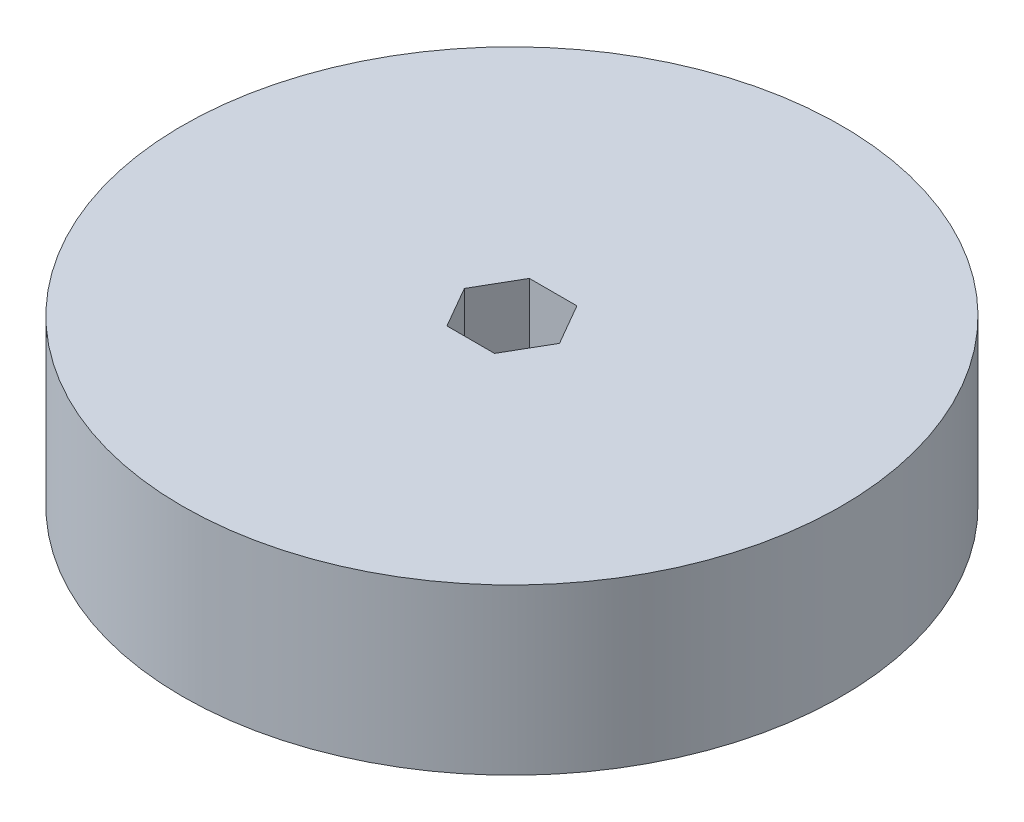
ISO-10303-21;
HEADER;
FILE_DESCRIPTION(('STEP AP214'),'2;1');
FILE_NAME('part.step','',(''),(''),'','','');
FILE_SCHEMA(('AUTOMOTIVE_DESIGN { 1 0 10303 214 1 1 1 1 }'));
ENDSEC;
DATA;
#1=APPLICATION_CONTEXT('core data for automotive mechanical design processes');
#2=APPLICATION_PROTOCOL_DEFINITION('international standard','automotive_design',2000,#1);
#3=PRODUCT_CONTEXT('',#1,'mechanical');
#4=PRODUCT('Part','Part','',(#3));
#5=PRODUCT_RELATED_PRODUCT_CATEGORY('part','',(#4));
#6=PRODUCT_DEFINITION_FORMATION('','',#4);
#7=PRODUCT_DEFINITION_CONTEXT('part definition',#1,'design');
#8=PRODUCT_DEFINITION('design','',#6,#7);
#9=PRODUCT_DEFINITION_SHAPE('','',#8);
#10=(LENGTH_UNIT() NAMED_UNIT(*) SI_UNIT(.MILLI.,.METRE.));
#11=(NAMED_UNIT(*) PLANE_ANGLE_UNIT() SI_UNIT($,.RADIAN.));
#12=(NAMED_UNIT(*) SI_UNIT($,.STERADIAN.) SOLID_ANGLE_UNIT());
#13=UNCERTAINTY_MEASURE_WITH_UNIT(LENGTH_MEASURE(1.E-05),#10,'distance_accuracy_value','');
#14=(GEOMETRIC_REPRESENTATION_CONTEXT(3) GLOBAL_UNCERTAINTY_ASSIGNED_CONTEXT((#13)) GLOBAL_UNIT_ASSIGNED_CONTEXT((#10,
#11,#12)) REPRESENTATION_CONTEXT('',''));
#15=CARTESIAN_POINT('',(0.,0.,0.));
#16=DIRECTION('',(0.,0.,1.));
#17=DIRECTION('',(1.,0.,0.));
#18=AXIS2_PLACEMENT_3D('',#15,#16,#17);
#19=CARTESIAN_POINT('',(0.,25.4,0.));
#20=DIRECTION('',(0.,1.,0.));
#21=DIRECTION('',(0.,0.,1.));
#22=AXIS2_PLACEMENT_3D('',#19,#20,#21);
#23=PLANE('',#22);
#24=CARTESIAN_POINT('',(0.,25.4,0.));
#25=DIRECTION('',(0.,1.,0.));
#26=DIRECTION('',(0.,0.,1.));
#27=AXIS2_PLACEMENT_3D('',#24,#25,#26);
#28=CIRCLE('',#27,50.8);
#29=CARTESIAN_POINT('',(0.,25.4,50.8));
#30=VERTEX_POINT('',#29);
#31=EDGE_CURVE('E11',#30,#30,#28,.T.);
#32=ORIENTED_EDGE('',*,*,#31,.T.);
#33=EDGE_LOOP('',(#32));
#34=FACE_BOUND('',#33,.T.);
#35=DIRECTION('',(0.5,0.,-0.866025403784439));
#36=VECTOR('',#35,1.);
#37=CARTESIAN_POINT('',(3.66617420935412,25.4,6.35));
#38=LINE('',#37,#36);
#39=CARTESIAN_POINT('',(3.66617420935412,25.4,6.35));
#40=VERTEX_POINT('',#39);
#41=CARTESIAN_POINT('',(7.33234841870824,25.4,0.));
#42=VERTEX_POINT('',#41);
#43=EDGE_CURVE('E106',#40,#42,#38,.T.);
#44=ORIENTED_EDGE('',*,*,#43,.F.);
#45=DIRECTION('',(1.,0.,0.));
#46=VECTOR('',#45,1.);
#47=CARTESIAN_POINT('',(-3.66617420935412,25.4,6.35));
#48=LINE('',#47,#46);
#49=CARTESIAN_POINT('',(-3.66617420935412,25.4,6.35));
#50=VERTEX_POINT('',#49);
#51=EDGE_CURVE('E97',#50,#40,#48,.T.);
#52=ORIENTED_EDGE('',*,*,#51,.F.);
#53=DIRECTION('',(0.5,0.,0.866025403784438));
#54=VECTOR('',#53,1.);
#55=CARTESIAN_POINT('',(-7.33234841870825,25.4,0.));
#56=LINE('',#55,#54);
#57=CARTESIAN_POINT('',(-7.33234841870825,25.4,0.));
#58=VERTEX_POINT('',#57);
#59=EDGE_CURVE('E131',#58,#50,#56,.T.);
#60=ORIENTED_EDGE('',*,*,#59,.F.);
#61=DIRECTION('',(-0.5,0.,0.866025403784439));
#62=VECTOR('',#61,1.);
#63=CARTESIAN_POINT('',(-3.66617420935412,25.4,-6.35));
#64=LINE('',#63,#62);
#65=CARTESIAN_POINT('',(-3.66617420935412,25.4,-6.35));
#66=VERTEX_POINT('',#65);
#67=EDGE_CURVE('E128',#66,#58,#64,.T.);
#68=ORIENTED_EDGE('',*,*,#67,.F.);
#69=DIRECTION('',(-1.,0.,0.));
#70=VECTOR('',#69,1.);
#71=CARTESIAN_POINT('',(3.66617420935412,25.4,-6.35));
#72=LINE('',#71,#70);
#73=CARTESIAN_POINT('',(3.66617420935412,25.4,-6.35));
#74=VERTEX_POINT('',#73);
#75=EDGE_CURVE('E123',#74,#66,#72,.T.);
#76=ORIENTED_EDGE('',*,*,#75,.F.);
#77=DIRECTION('',(-0.5,0.,-0.866025403784438));
#78=VECTOR('',#77,1.);
#79=CARTESIAN_POINT('',(7.33234841870824,25.4,0.));
#80=LINE('',#79,#78);
#81=EDGE_CURVE('E119',#42,#74,#80,.T.);
#82=ORIENTED_EDGE('',*,*,#81,.F.);
#83=EDGE_LOOP('',(#44,#52,#60,#68,#76,#82));
#84=FACE_BOUND('',#83,.T.);
#85=ADVANCED_FACE('F43',(#34,#84),#23,.T.);
#86=CARTESIAN_POINT('',(0.,0.,0.));
#87=DIRECTION('',(0.,1.,0.));
#88=DIRECTION('',(0.,0.,1.));
#89=AXIS2_PLACEMENT_3D('',#86,#87,#88);
#90=PLANE('',#89);
#91=CARTESIAN_POINT('',(0.,0.,0.));
#92=DIRECTION('',(0.,1.,0.));
#93=DIRECTION('',(0.,0.,1.));
#94=AXIS2_PLACEMENT_3D('',#91,#92,#93);
#95=CIRCLE('',#94,50.8);
#96=CARTESIAN_POINT('',(0.,0.,50.8));
#97=VERTEX_POINT('',#96);
#98=EDGE_CURVE('E47',#97,#97,#95,.T.);
#99=ORIENTED_EDGE('',*,*,#98,.F.);
#100=EDGE_LOOP('',(#99));
#101=FACE_BOUND('',#100,.T.);
#102=DIRECTION('',(1.,0.,0.));
#103=VECTOR('',#102,1.);
#104=CARTESIAN_POINT('',(-3.66617420935412,0.,6.35));
#105=LINE('',#104,#103);
#106=CARTESIAN_POINT('',(-3.66617420935412,0.,6.35));
#107=VERTEX_POINT('',#106);
#108=CARTESIAN_POINT('',(3.66617420935412,0.,6.35));
#109=VERTEX_POINT('',#108);
#110=EDGE_CURVE('E67',#107,#109,#105,.T.);
#111=ORIENTED_EDGE('',*,*,#110,.T.);
#112=DIRECTION('',(0.5,0.,-0.866025403784439));
#113=VECTOR('',#112,1.);
#114=CARTESIAN_POINT('',(3.66617420935412,0.,6.35));
#115=LINE('',#114,#113);
#116=CARTESIAN_POINT('',(7.33234841870824,0.,0.));
#117=VERTEX_POINT('',#116);
#118=EDGE_CURVE('E113',#109,#117,#115,.T.);
#119=ORIENTED_EDGE('',*,*,#118,.T.);
#120=DIRECTION('',(-0.5,0.,-0.866025403784438));
#121=VECTOR('',#120,1.);
#122=CARTESIAN_POINT('',(7.33234841870824,0.,0.));
#123=LINE('',#122,#121);
#124=CARTESIAN_POINT('',(3.66617420935412,0.,-6.35));
#125=VERTEX_POINT('',#124);
#126=EDGE_CURVE('E138',#117,#125,#123,.T.);
#127=ORIENTED_EDGE('',*,*,#126,.T.);
#128=DIRECTION('',(-1.,0.,0.));
#129=VECTOR('',#128,1.);
#130=CARTESIAN_POINT('',(3.66617420935412,0.,-6.35));
#131=LINE('',#130,#129);
#132=CARTESIAN_POINT('',(-3.66617420935412,0.,-6.35));
#133=VERTEX_POINT('',#132);
#134=EDGE_CURVE('E142',#125,#133,#131,.T.);
#135=ORIENTED_EDGE('',*,*,#134,.T.);
#136=DIRECTION('',(-0.5,0.,0.866025403784439));
#137=VECTOR('',#136,1.);
#138=CARTESIAN_POINT('',(-3.66617420935412,0.,-6.35));
#139=LINE('',#138,#137);
#140=CARTESIAN_POINT('',(-7.33234841870825,0.,0.));
#141=VERTEX_POINT('',#140);
#142=EDGE_CURVE('E146',#133,#141,#139,.T.);
#143=ORIENTED_EDGE('',*,*,#142,.T.);
#144=DIRECTION('',(0.5,0.,0.866025403784438));
#145=VECTOR('',#144,1.);
#146=CARTESIAN_POINT('',(-7.33234841870825,0.,0.));
#147=LINE('',#146,#145);
#148=EDGE_CURVE('E107',#141,#107,#147,.T.);
#149=ORIENTED_EDGE('',*,*,#148,.T.);
#150=EDGE_LOOP('',(#111,#119,#127,#135,#143,#149));
#151=FACE_BOUND('',#150,.T.);
#152=ADVANCED_FACE('F170',(#101,#151),#90,.F.);
#153=CARTESIAN_POINT('',(0.,25.4,0.));
#154=DIRECTION('',(0.,-1.,0.));
#155=DIRECTION('',(0.,0.,-1.));
#156=AXIS2_PLACEMENT_3D('',#153,#154,#155);
#157=CYLINDRICAL_SURFACE('',#156,50.8);
#158=ORIENTED_EDGE('',*,*,#31,.F.);
#159=EDGE_LOOP('',(#158));
#160=FACE_BOUND('',#159,.T.);
#161=ORIENTED_EDGE('',*,*,#98,.T.);
#162=EDGE_LOOP('',(#161));
#163=FACE_BOUND('',#162,.T.);
#164=ADVANCED_FACE('F45',(#160,#163),#157,.T.);
#165=CARTESIAN_POINT('',(-3.66617420935412,25.4,6.35));
#166=DIRECTION('',(0.,0.,-1.));
#167=DIRECTION('',(-1.,0.,0.));
#168=AXIS2_PLACEMENT_3D('',#165,#166,#167);
#169=PLANE('',#168);
#170=ORIENTED_EDGE('',*,*,#110,.F.);
#171=DIRECTION('',(0.,-1.,0.));
#172=VECTOR('',#171,1.);
#173=CARTESIAN_POINT('',(-3.66617420935412,25.4,6.35));
#174=LINE('',#173,#172);
#175=EDGE_CURVE('E101',#50,#107,#174,.T.);
#176=ORIENTED_EDGE('',*,*,#175,.F.);
#177=ORIENTED_EDGE('',*,*,#51,.T.);
#178=DIRECTION('',(0.,-1.,0.));
#179=VECTOR('',#178,1.);
#180=CARTESIAN_POINT('',(3.66617420935412,25.4,6.35));
#181=LINE('',#180,#179);
#182=EDGE_CURVE('E100',#40,#109,#181,.T.);
#183=ORIENTED_EDGE('',*,*,#182,.T.);
#184=EDGE_LOOP('',(#170,#176,#177,#183));
#185=FACE_BOUND('',#184,.T.);
#186=ADVANCED_FACE('F99',(#185),#169,.T.);
#187=CARTESIAN_POINT('',(3.66617420935412,25.4,6.35));
#188=DIRECTION('',(-0.866025403784439,0.,-0.5));
#189=DIRECTION('',(-0.5,0.,0.866025403784439));
#190=AXIS2_PLACEMENT_3D('',#187,#188,#189);
#191=PLANE('',#190);
#192=ORIENTED_EDGE('',*,*,#118,.F.);
#193=ORIENTED_EDGE('',*,*,#182,.F.);
#194=ORIENTED_EDGE('',*,*,#43,.T.);
#195=DIRECTION('',(0.,-1.,0.));
#196=VECTOR('',#195,1.);
#197=CARTESIAN_POINT('',(7.33234841870824,25.4,0.));
#198=LINE('',#197,#196);
#199=EDGE_CURVE('E115',#42,#117,#198,.T.);
#200=ORIENTED_EDGE('',*,*,#199,.T.);
#201=EDGE_LOOP('',(#192,#193,#194,#200));
#202=FACE_BOUND('',#201,.T.);
#203=ADVANCED_FACE('F110',(#202),#191,.T.);
#204=CARTESIAN_POINT('',(7.33234841870824,25.4,0.));
#205=DIRECTION('',(-0.866025403784438,0.,0.5));
#206=DIRECTION('',(0.5,0.,0.866025403784438));
#207=AXIS2_PLACEMENT_3D('',#204,#205,#206);
#208=PLANE('',#207);
#209=ORIENTED_EDGE('',*,*,#126,.F.);
#210=ORIENTED_EDGE('',*,*,#199,.F.);
#211=ORIENTED_EDGE('',*,*,#81,.T.);
#212=DIRECTION('',(0.,-1.,0.));
#213=VECTOR('',#212,1.);
#214=CARTESIAN_POINT('',(3.66617420935412,25.4,-6.35));
#215=LINE('',#214,#213);
#216=EDGE_CURVE('E160',#74,#125,#215,.T.);
#217=ORIENTED_EDGE('',*,*,#216,.T.);
#218=EDGE_LOOP('',(#209,#210,#211,#217));
#219=FACE_BOUND('',#218,.T.);
#220=ADVANCED_FACE('F166',(#219),#208,.T.);
#221=CARTESIAN_POINT('',(3.66617420935412,25.4,-6.35));
#222=DIRECTION('',(0.,0.,1.));
#223=DIRECTION('',(1.,0.,0.));
#224=AXIS2_PLACEMENT_3D('',#221,#222,#223);
#225=PLANE('',#224);
#226=ORIENTED_EDGE('',*,*,#134,.F.);
#227=ORIENTED_EDGE('',*,*,#216,.F.);
#228=ORIENTED_EDGE('',*,*,#75,.T.);
#229=DIRECTION('',(0.,-1.,0.));
#230=VECTOR('',#229,1.);
#231=CARTESIAN_POINT('',(-3.66617420935412,25.4,-6.35));
#232=LINE('',#231,#230);
#233=EDGE_CURVE('E157',#66,#133,#232,.T.);
#234=ORIENTED_EDGE('',*,*,#233,.T.);
#235=EDGE_LOOP('',(#226,#227,#228,#234));
#236=FACE_BOUND('',#235,.T.);
#237=ADVANCED_FACE('F178',(#236),#225,.T.);
#238=CARTESIAN_POINT('',(-3.66617420935412,25.4,-6.35));
#239=DIRECTION('',(0.866025403784439,0.,0.5));
#240=DIRECTION('',(0.5,0.,-0.866025403784439));
#241=AXIS2_PLACEMENT_3D('',#238,#239,#240);
#242=PLANE('',#241);
#243=ORIENTED_EDGE('',*,*,#142,.F.);
#244=ORIENTED_EDGE('',*,*,#233,.F.);
#245=ORIENTED_EDGE('',*,*,#67,.T.);
#246=DIRECTION('',(0.,-1.,0.));
#247=VECTOR('',#246,1.);
#248=CARTESIAN_POINT('',(-7.33234841870825,25.4,0.));
#249=LINE('',#248,#247);
#250=EDGE_CURVE('E59',#58,#141,#249,.T.);
#251=ORIENTED_EDGE('',*,*,#250,.T.);
#252=EDGE_LOOP('',(#243,#244,#245,#251));
#253=FACE_BOUND('',#252,.T.);
#254=ADVANCED_FACE('F176',(#253),#242,.T.);
#255=CARTESIAN_POINT('',(-7.33234841870825,25.4,0.));
#256=DIRECTION('',(0.866025403784438,0.,-0.5));
#257=DIRECTION('',(-0.5,0.,-0.866025403784438));
#258=AXIS2_PLACEMENT_3D('',#255,#256,#257);
#259=PLANE('',#258);
#260=ORIENTED_EDGE('',*,*,#148,.F.);
#261=ORIENTED_EDGE('',*,*,#250,.F.);
#262=ORIENTED_EDGE('',*,*,#59,.T.);
#263=ORIENTED_EDGE('',*,*,#175,.T.);
#264=EDGE_LOOP('',(#260,#261,#262,#263));
#265=FACE_BOUND('',#264,.T.);
#266=ADVANCED_FACE('F172',(#265),#259,.T.);
#267=CLOSED_SHELL('',(#85,#152,#164,#186,#203,#220,#237,#254,#266));
#268=MANIFOLD_SOLID_BREP('B2',#267);
#269=ADVANCED_BREP_SHAPE_REPRESENTATION('',(#18,#268),#14);
#270=SHAPE_DEFINITION_REPRESENTATION(#9,#269);
ENDSEC;
END-ISO-10303-21;
